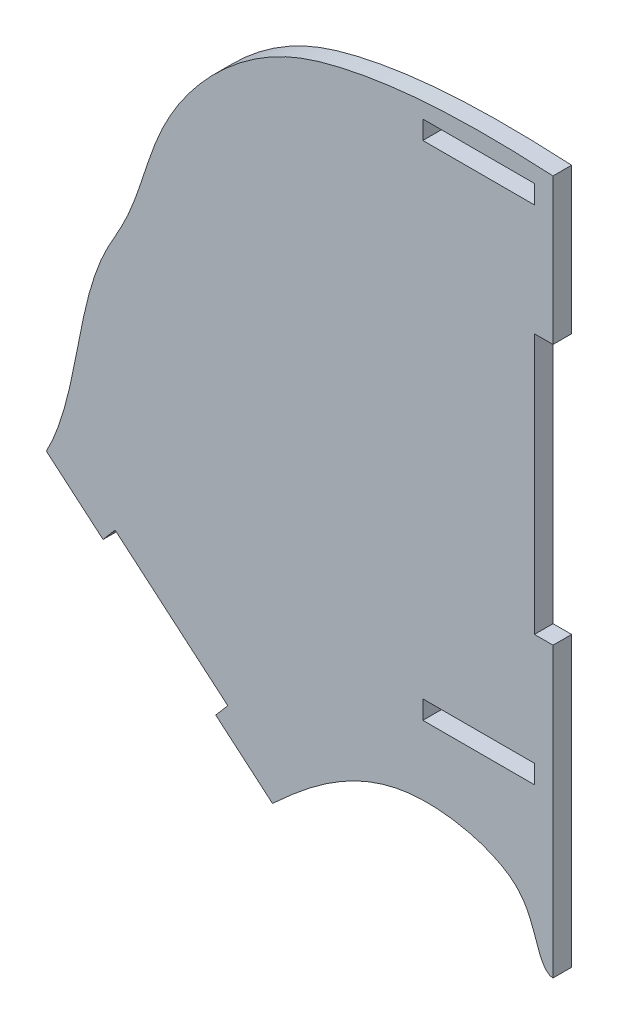
ISO-10303-21;
HEADER;
FILE_DESCRIPTION(('STEP AP214'),'2;1');
FILE_NAME('part.step','',(''),(''),'','','');
FILE_SCHEMA(('AUTOMOTIVE_DESIGN { 1 0 10303 214 1 1 1 1 }'));
ENDSEC;
DATA;
#1=APPLICATION_CONTEXT('core data for automotive mechanical design processes');
#2=APPLICATION_PROTOCOL_DEFINITION('international standard','automotive_design',2000,#1);
#3=PRODUCT_CONTEXT('',#1,'mechanical');
#4=PRODUCT('Part','Part','',(#3));
#5=PRODUCT_RELATED_PRODUCT_CATEGORY('part','',(#4));
#6=PRODUCT_DEFINITION_FORMATION('','',#4);
#7=PRODUCT_DEFINITION_CONTEXT('part definition',#1,'design');
#8=PRODUCT_DEFINITION('design','',#6,#7);
#9=PRODUCT_DEFINITION_SHAPE('','',#8);
#10=(LENGTH_UNIT() NAMED_UNIT(*) SI_UNIT(.MILLI.,.METRE.));
#11=(NAMED_UNIT(*) PLANE_ANGLE_UNIT() SI_UNIT($,.RADIAN.));
#12=(NAMED_UNIT(*) SI_UNIT($,.STERADIAN.) SOLID_ANGLE_UNIT());
#13=UNCERTAINTY_MEASURE_WITH_UNIT(LENGTH_MEASURE(1.E-05),#10,'distance_accuracy_value','');
#14=(GEOMETRIC_REPRESENTATION_CONTEXT(3) GLOBAL_UNCERTAINTY_ASSIGNED_CONTEXT((#13)) GLOBAL_UNIT_ASSIGNED_CONTEXT((#10,
#11,#12)) REPRESENTATION_CONTEXT('',''));
#15=CARTESIAN_POINT('',(0.,0.,0.));
#16=DIRECTION('',(0.,0.,1.));
#17=DIRECTION('',(1.,0.,0.));
#18=AXIS2_PLACEMENT_3D('',#15,#16,#17);
#19=CARTESIAN_POINT('',(128.16831907634,357.821631056354,0.558515458938516));
#20=DIRECTION('',(0.,0.,-1.));
#21=DIRECTION('',(-1.,0.,0.));
#22=AXIS2_PLACEMENT_3D('',#19,#20,#21);
#23=PLANE('',#22);
#24=CARTESIAN_POINT('',(190.920224240419,377.495203298685,0.558515458938516));
#25=CARTESIAN_POINT('',(179.228577403841,378.123882118353,0.558515458938516));
#26=CARTESIAN_POINT('',(164.047723098161,378.073363727816,0.558515458938516));
#27=CARTESIAN_POINT('',(143.978890164457,372.597839563043,0.558515458938516));
#28=CARTESIAN_POINT('',(132.17034424929,364.03285747436,0.558515458938516));
#29=CARTESIAN_POINT('',(122.518397053617,350.063428059534,0.558515458938516));
#30=CARTESIAN_POINT('',(119.794011723898,337.005382787157,0.558515458938516));
#31=CARTESIAN_POINT('',(109.10983386091,319.977623746502,0.558515458938516));
#32=CARTESIAN_POINT('',(110.074675896079,304.22790963995,0.558515458938516));
#33=CARTESIAN_POINT('',(104.425717212394,293.558329542994,0.558515458938516));
#34=B_SPLINE_CURVE_WITH_KNOTS('',3,(#24,#25,#26,#27,#28,#29,#30,#31,#32,#33),.UNSPECIFIED.,.F.,
.F.,(4,1,1,1,1,1,1,4),(0.,0.256177885566044,0.326770854067347,0.450574258980141,
0.564972920578244,0.689615914149957,0.73575471902178,1.),.UNSPECIFIED.);
#35=CARTESIAN_POINT('',(190.920224240419,377.495203298685,0.558515458938516));
#36=VERTEX_POINT('',#35);
#37=CARTESIAN_POINT('',(104.425717212394,293.558329542994,0.558515458938516));
#38=VERTEX_POINT('',#37);
#39=EDGE_CURVE('E290',#36,#38,#34,.T.);
#40=ORIENTED_EDGE('',*,*,#39,.F.);
#41=DIRECTION('',(0.,1.,0.));
#42=VECTOR('',#41,1.);
#43=CARTESIAN_POINT('',(190.920224240419,258.914024308651,0.558515458938516));
#44=LINE('',#43,#42);
#45=CARTESIAN_POINT('',(190.920224240419,352.57227708954,0.558515457864788));
#46=VERTEX_POINT('',#45);
#47=EDGE_CURVE('E551',#46,#36,#44,.T.);
#48=ORIENTED_EDGE('',*,*,#47,.F.);
#49=DIRECTION('',(1.,0.,0.));
#50=VECTOR('',#49,1.);
#51=CARTESIAN_POINT('',(187.745224240419,352.57227708954,0.558515457864788));
#52=LINE('',#51,#50);
#53=CARTESIAN_POINT('',(187.745224240419,352.57227708954,0.558515457864788));
#54=VERTEX_POINT('',#53);
#55=EDGE_CURVE('E226',#54,#46,#52,.T.);
#56=ORIENTED_EDGE('',*,*,#55,.F.);
#57=DIRECTION('',(0.,-1.,0.));
#58=VECTOR('',#57,1.);
#59=CARTESIAN_POINT('',(187.745224240419,357.821631056354,0.558515458938516));
#60=LINE('',#59,#58);
#61=CARTESIAN_POINT('',(187.745224240419,308.12227708954,0.55851545786478));
#62=VERTEX_POINT('',#61);
#63=EDGE_CURVE('E225',#54,#62,#60,.T.);
#64=ORIENTED_EDGE('',*,*,#63,.T.);
#65=DIRECTION('',(1.,0.,0.));
#66=VECTOR('',#65,1.);
#67=CARTESIAN_POINT('',(187.745224240419,308.12227708954,0.55851545786478));
#68=LINE('',#67,#66);
#69=CARTESIAN_POINT('',(190.920224240419,308.12227708954,0.55851545786478));
#70=VERTEX_POINT('',#69);
#71=EDGE_CURVE('E228',#62,#70,#68,.T.);
#72=ORIENTED_EDGE('',*,*,#71,.T.);
#73=CARTESIAN_POINT('',(190.920224240419,258.914024308651,0.558515458938516));
#74=VERTEX_POINT('',#73);
#75=EDGE_CURVE('E298',#74,#70,#44,.T.);
#76=ORIENTED_EDGE('',*,*,#75,.F.);
#77=CARTESIAN_POINT('',(143.022728413072,260.774121233985,0.558515458938516));
#78=CARTESIAN_POINT('',(149.722749072518,266.960677117123,0.558515458938516));
#79=CARTESIAN_POINT('',(161.869600978462,276.820189664583,0.558515458938516));
#80=CARTESIAN_POINT('',(182.454516969944,272.399090910471,0.558515458938516));
#81=CARTESIAN_POINT('',(187.43016425015,266.375487534413,0.558515458938516));
#82=CARTESIAN_POINT('',(189.097390558734,258.932616631534,0.558515458938516));
#83=CARTESIAN_POINT('',(190.920224240419,258.914024308651,0.558515458938516));
#84=B_SPLINE_CURVE_WITH_KNOTS('',3,(#77,#78,#79,#80,#81,#82,#83),.UNSPECIFIED.,.F.,.F.,(4,1,1,1,
4),(0.,0.461148567866959,0.724471904206736,0.870774393200556,1.),.UNSPECIFIED.);
#85=CARTESIAN_POINT('',(143.022728413072,260.774121233985,0.558515458938516));
#86=VERTEX_POINT('',#85);
#87=EDGE_CURVE('E547',#86,#74,#84,.T.);
#88=ORIENTED_EDGE('',*,*,#87,.F.);
#89=DIRECTION('',(0.762165840447723,-0.647381828332102,0.));
#90=VECTOR('',#89,1.);
#91=CARTESIAN_POINT('',(104.425717212394,293.558329542994,0.558515458938516));
#92=LINE('',#91,#90);
#93=CARTESIAN_POINT('',(133.343222239386,268.995870453803,0.558515458938516));
#94=VERTEX_POINT('',#93);
#95=EDGE_CURVE('E537',#94,#86,#92,.T.);
#96=ORIENTED_EDGE('',*,*,#95,.F.);
#97=DIRECTION('',(-0.647381828332102,-0.762165840447724,0.));
#98=VECTOR('',#97,1.);
#99=CARTESIAN_POINT('',(151.708827152805,290.617788295133,0.558515458938516));
#100=LINE('',#99,#98);
#101=CARTESIAN_POINT('',(135.39865954434,271.415746997224,0.558515458938516));
#102=VERTEX_POINT('',#101);
#103=EDGE_CURVE('E271',#102,#94,#100,.T.);
#104=ORIENTED_EDGE('',*,*,#103,.F.);
#105=DIRECTION('',(-0.762165840447724,0.647381828332102,0.));
#106=VECTOR('',#105,1.);
#107=CARTESIAN_POINT('',(88.5648508248975,311.196271270968,0.558515458938516));
#108=LINE('',#107,#106);
#109=CARTESIAN_POINT('',(116.160660691035,287.756456866598,0.558515458938516));
#110=VERTEX_POINT('',#109);
#111=EDGE_CURVE('E11',#102,#110,#108,.T.);
#112=ORIENTED_EDGE('',*,*,#111,.T.);
#113=DIRECTION('',(-0.647381828332102,-0.762165840447724,0.));
#114=VECTOR('',#113,1.);
#115=CARTESIAN_POINT('',(132.4708282995,306.958498164507,0.558515458938516));
#116=LINE('',#115,#114);
#117=CARTESIAN_POINT('',(114.10522338608,285.336580323177,0.558515458938516));
#118=VERTEX_POINT('',#117);
#119=EDGE_CURVE('E278',#110,#118,#116,.T.);
#120=ORIENTED_EDGE('',*,*,#119,.T.);
#121=EDGE_CURVE('E538',#38,#118,#92,.T.);
#122=ORIENTED_EDGE('',*,*,#121,.F.);
#123=EDGE_LOOP('',(#40,#48,#56,#64,#72,#76,#88,#96,#104,#112,#120,#122));
#124=FACE_BOUND('',#123,.T.);
#125=DIRECTION('',(-1.,0.,0.));
#126=VECTOR('',#125,1.);
#127=CARTESIAN_POINT('',(128.16831907634,371.62227708954,0.558515458938516));
#128=LINE('',#127,#126);
#129=CARTESIAN_POINT('',(187.745224240419,371.62227708954,0.55851545786479));
#130=VERTEX_POINT('',#129);
#131=CARTESIAN_POINT('',(168.695224240419,371.62227708954,0.558515458938516));
#132=VERTEX_POINT('',#131);
#133=EDGE_CURVE('E248',#130,#132,#128,.T.);
#134=ORIENTED_EDGE('',*,*,#133,.F.);
#135=DIRECTION('',(0.,1.,0.));
#136=VECTOR('',#135,1.);
#137=CARTESIAN_POINT('',(187.745224240419,371.62227708954,0.55851545786479));
#138=LINE('',#137,#136);
#139=CARTESIAN_POINT('',(187.745224240419,374.79727708954,0.55851545786479));
#140=VERTEX_POINT('',#139);
#141=EDGE_CURVE('E236',#130,#140,#138,.T.);
#142=ORIENTED_EDGE('',*,*,#141,.T.);
#143=DIRECTION('',(-1.,0.,0.));
#144=VECTOR('',#143,1.);
#145=CARTESIAN_POINT('',(128.16831907634,374.79727708954,0.558515458938516));
#146=LINE('',#145,#144);
#147=CARTESIAN_POINT('',(168.695224240419,374.79727708954,0.55851545786479));
#148=VERTEX_POINT('',#147);
#149=EDGE_CURVE('E256',#140,#148,#146,.T.);
#150=ORIENTED_EDGE('',*,*,#149,.T.);
#151=DIRECTION('',(0.,1.,0.));
#152=VECTOR('',#151,1.);
#153=CARTESIAN_POINT('',(168.695224240419,371.62227708954,0.55851545786479));
#154=LINE('',#153,#152);
#155=EDGE_CURVE('E235',#132,#148,#154,.T.);
#156=ORIENTED_EDGE('',*,*,#155,.F.);
#157=EDGE_LOOP('',(#134,#142,#150,#156));
#158=FACE_BOUND('',#157,.T.);
#159=DIRECTION('',(-1.,0.,0.));
#160=VECTOR('',#159,1.);
#161=CARTESIAN_POINT('',(128.16831907634,285.89727708954,0.558515458938516));
#162=LINE('',#161,#160);
#163=CARTESIAN_POINT('',(187.745224240419,285.89727708954,0.558515458938515));
#164=VERTEX_POINT('',#163);
#165=CARTESIAN_POINT('',(168.695224240419,285.89727708954,0.558515458938516));
#166=VERTEX_POINT('',#165);
#167=EDGE_CURVE('E180',#164,#166,#162,.T.);
#168=ORIENTED_EDGE('',*,*,#167,.F.);
#169=DIRECTION('',(0.,1.,0.));
#170=VECTOR('',#169,1.);
#171=CARTESIAN_POINT('',(187.745224240419,357.821631056354,0.558515458938516));
#172=LINE('',#171,#170);
#173=CARTESIAN_POINT('',(187.745224240419,289.07227708954,0.558515458938515));
#174=VERTEX_POINT('',#173);
#175=EDGE_CURVE('E190',#164,#174,#172,.T.);
#176=ORIENTED_EDGE('',*,*,#175,.T.);
#177=DIRECTION('',(-1.,0.,0.));
#178=VECTOR('',#177,1.);
#179=CARTESIAN_POINT('',(128.16831907634,289.07227708954,0.558515458938516));
#180=LINE('',#179,#178);
#181=CARTESIAN_POINT('',(168.695224240419,289.07227708954,0.558515458938515));
#182=VERTEX_POINT('',#181);
#183=EDGE_CURVE('E202',#174,#182,#180,.T.);
#184=ORIENTED_EDGE('',*,*,#183,.T.);
#185=DIRECTION('',(0.,1.,0.));
#186=VECTOR('',#185,1.);
#187=CARTESIAN_POINT('',(168.695224240419,357.821631056354,0.558515458938516));
#188=LINE('',#187,#186);
#189=EDGE_CURVE('E205',#166,#182,#188,.T.);
#190=ORIENTED_EDGE('',*,*,#189,.F.);
#191=EDGE_LOOP('',(#168,#176,#184,#190));
#192=FACE_BOUND('',#191,.T.);
#193=ADVANCED_FACE('F35',(#124,#158,#192),#23,.T.);
#194=CARTESIAN_POINT('',(128.16831907634,357.821631056354,3.73351545858061));
#195=DIRECTION('',(0.,0.,-1.));
#196=DIRECTION('',(-1.,0.,0.));
#197=AXIS2_PLACEMENT_3D('',#194,#195,#196);
#198=PLANE('',#197);
#199=DIRECTION('',(-1.,0.,0.));
#200=VECTOR('',#199,1.);
#201=CARTESIAN_POINT('',(128.16831907634,289.07227708954,3.73351545858061));
#202=LINE('',#201,#200);
#203=CARTESIAN_POINT('',(187.745224240419,289.07227708954,3.73351545750387));
#204=VERTEX_POINT('',#203);
#205=CARTESIAN_POINT('',(168.695224240419,289.07227708954,3.73351545858061));
#206=VERTEX_POINT('',#205);
#207=EDGE_CURVE('E194',#204,#206,#202,.T.);
#208=ORIENTED_EDGE('',*,*,#207,.F.);
#209=DIRECTION('',(0.,1.,0.));
#210=VECTOR('',#209,1.);
#211=CARTESIAN_POINT('',(187.745224240419,285.89727708954,3.73351545750387));
#212=LINE('',#211,#210);
#213=CARTESIAN_POINT('',(187.745224240419,285.89727708954,3.73351545750387));
#214=VERTEX_POINT('',#213);
#215=EDGE_CURVE('E187',#214,#204,#212,.T.);
#216=ORIENTED_EDGE('',*,*,#215,.F.);
#217=DIRECTION('',(-1.,0.,0.));
#218=VECTOR('',#217,1.);
#219=CARTESIAN_POINT('',(128.16831907634,285.89727708954,3.73351545858061));
#220=LINE('',#219,#218);
#221=CARTESIAN_POINT('',(168.695224240419,285.89727708954,3.73351545750387));
#222=VERTEX_POINT('',#221);
#223=EDGE_CURVE('E172',#214,#222,#220,.T.);
#224=ORIENTED_EDGE('',*,*,#223,.T.);
#225=DIRECTION('',(0.,1.,0.));
#226=VECTOR('',#225,1.);
#227=CARTESIAN_POINT('',(168.695224240419,285.89727708954,3.73351545750387));
#228=LINE('',#227,#226);
#229=EDGE_CURVE('E181',#222,#206,#228,.T.);
#230=ORIENTED_EDGE('',*,*,#229,.T.);
#231=EDGE_LOOP('',(#208,#216,#224,#230));
#232=FACE_BOUND('',#231,.T.);
#233=DIRECTION('',(0.,1.,0.));
#234=VECTOR('',#233,1.);
#235=CARTESIAN_POINT('',(190.920224240419,258.914024308651,3.73351545858061));
#236=LINE('',#235,#234);
#237=CARTESIAN_POINT('',(190.920224240419,258.914024308651,3.73351545858061));
#238=VERTEX_POINT('',#237);
#239=CARTESIAN_POINT('',(190.920224240419,308.12227708954,3.73351545858061));
#240=VERTEX_POINT('',#239);
#241=EDGE_CURVE('E311',#238,#240,#236,.T.);
#242=ORIENTED_EDGE('',*,*,#241,.T.);
#243=DIRECTION('',(1.,0.,0.));
#244=VECTOR('',#243,1.);
#245=CARTESIAN_POINT('',(187.745224240419,308.12227708954,3.73351545858061));
#246=LINE('',#245,#244);
#247=CARTESIAN_POINT('',(187.745224240419,308.12227708954,3.73351545858061));
#248=VERTEX_POINT('',#247);
#249=EDGE_CURVE('E218',#248,#240,#246,.T.);
#250=ORIENTED_EDGE('',*,*,#249,.F.);
#251=DIRECTION('',(0.,-1.,0.));
#252=VECTOR('',#251,1.);
#253=CARTESIAN_POINT('',(187.745224240419,352.57227708954,3.73351545858061));
#254=LINE('',#253,#252);
#255=CARTESIAN_POINT('',(187.745224240419,352.57227708954,3.73351545858061));
#256=VERTEX_POINT('',#255);
#257=EDGE_CURVE('E209',#256,#248,#254,.T.);
#258=ORIENTED_EDGE('',*,*,#257,.F.);
#259=DIRECTION('',(1.,0.,0.));
#260=VECTOR('',#259,1.);
#261=CARTESIAN_POINT('',(187.745224240419,352.57227708954,3.73351545858061));
#262=LINE('',#261,#260);
#263=CARTESIAN_POINT('',(190.920224240419,352.57227708954,3.73351545858061));
#264=VERTEX_POINT('',#263);
#265=EDGE_CURVE('E222',#256,#264,#262,.T.);
#266=ORIENTED_EDGE('',*,*,#265,.T.);
#267=CARTESIAN_POINT('',(190.920224240419,377.495203298685,3.73351545858061));
#268=VERTEX_POINT('',#267);
#269=EDGE_CURVE('E310',#264,#268,#236,.T.);
#270=ORIENTED_EDGE('',*,*,#269,.T.);
#271=CARTESIAN_POINT('',(190.920224240419,377.495203298685,3.73351545858061));
#272=CARTESIAN_POINT('',(179.228577403841,378.123882118353,3.73351545858061));
#273=CARTESIAN_POINT('',(164.047723098161,378.073363727816,3.73351545858061));
#274=CARTESIAN_POINT('',(143.978890164457,372.597839563043,3.73351545858061));
#275=CARTESIAN_POINT('',(132.17034424929,364.03285747436,3.73351545858061));
#276=CARTESIAN_POINT('',(122.518397053617,350.063428059534,3.73351545858061));
#277=CARTESIAN_POINT('',(119.794011723898,337.005382787157,3.73351545858061));
#278=CARTESIAN_POINT('',(109.10983386091,319.977623746502,3.73351545858061));
#279=CARTESIAN_POINT('',(110.074675896079,304.22790963995,3.73351545858061));
#280=CARTESIAN_POINT('',(104.425717212394,293.558329542994,3.73351545858061));
#281=B_SPLINE_CURVE_WITH_KNOTS('',3,(#271,#272,#273,#274,#275,#276,#277,#278,#279,#280),
.UNSPECIFIED.,.F.,.F.,(4,1,1,1,1,1,1,4),(0.,0.256177885566044,0.326770854067347,
0.450574258980141,0.564972920578244,0.689615914149957,0.73575471902178,1.),.UNSPECIFIED.);
#282=CARTESIAN_POINT('',(104.425717212394,293.558329542994,3.73351545858061));
#283=VERTEX_POINT('',#282);
#284=EDGE_CURVE('E291',#268,#283,#281,.T.);
#285=ORIENTED_EDGE('',*,*,#284,.T.);
#286=DIRECTION('',(0.762165840447723,-0.647381828332102,0.));
#287=VECTOR('',#286,1.);
#288=CARTESIAN_POINT('',(104.425717212394,293.558329542994,3.73351545858061));
#289=LINE('',#288,#287);
#290=CARTESIAN_POINT('',(114.10522338608,285.336580323177,3.73351545858061));
#291=VERTEX_POINT('',#290);
#292=EDGE_CURVE('E299',#283,#291,#289,.T.);
#293=ORIENTED_EDGE('',*,*,#292,.T.);
#294=DIRECTION('',(-0.647381828332102,-0.762165840447724,0.));
#295=VECTOR('',#294,1.);
#296=CARTESIAN_POINT('',(132.4708282995,306.958498164507,3.73351545858061));
#297=LINE('',#296,#295);
#298=CARTESIAN_POINT('',(116.160660691035,287.756456866598,3.73351545858061));
#299=VERTEX_POINT('',#298);
#300=EDGE_CURVE('E279',#299,#291,#297,.T.);
#301=ORIENTED_EDGE('',*,*,#300,.F.);
#302=DIRECTION('',(0.762165840447724,-0.647381828332102,0.));
#303=VECTOR('',#302,1.);
#304=CARTESIAN_POINT('',(145.397980675125,262.922347723486,3.73351545858061));
#305=LINE('',#304,#303);
#306=CARTESIAN_POINT('',(135.39865954434,271.415746997224,3.73351545858061));
#307=VERTEX_POINT('',#306);
#308=EDGE_CURVE('E286',#299,#307,#305,.T.);
#309=ORIENTED_EDGE('',*,*,#308,.T.);
#310=DIRECTION('',(-0.647381828332102,-0.762165840447724,0.));
#311=VECTOR('',#310,1.);
#312=CARTESIAN_POINT('',(151.708827152805,290.617788295133,3.73351545858061));
#313=LINE('',#312,#311);
#314=CARTESIAN_POINT('',(133.343222239386,268.995870453803,3.73351545858061));
#315=VERTEX_POINT('',#314);
#316=EDGE_CURVE('E270',#307,#315,#313,.T.);
#317=ORIENTED_EDGE('',*,*,#316,.T.);
#318=CARTESIAN_POINT('',(143.022728413072,260.774121233985,3.73351545858061));
#319=VERTEX_POINT('',#318);
#320=EDGE_CURVE('E297',#315,#319,#289,.T.);
#321=ORIENTED_EDGE('',*,*,#320,.T.);
#322=CARTESIAN_POINT('',(143.022728413072,260.774121233985,3.73351545858061));
#323=CARTESIAN_POINT('',(149.722749072518,266.960677117123,3.73351545858061));
#324=CARTESIAN_POINT('',(161.869600978462,276.820189664583,3.73351545858061));
#325=CARTESIAN_POINT('',(182.454516969944,272.399090910471,3.73351545858061));
#326=CARTESIAN_POINT('',(187.43016425015,266.375487534413,3.73351545858061));
#327=CARTESIAN_POINT('',(189.097390558734,258.932616631534,3.73351545858061));
#328=CARTESIAN_POINT('',(190.920224240419,258.914024308651,3.73351545858061));
#329=B_SPLINE_CURVE_WITH_KNOTS('',3,(#322,#323,#324,#325,#326,#327,#328),.UNSPECIFIED.,.F.,.F.,
(4,1,1,1,4),(0.,0.461148567866959,0.724471904206736,0.870774393200556,1.),.UNSPECIFIED.);
#330=EDGE_CURVE('E305',#319,#238,#329,.T.);
#331=ORIENTED_EDGE('',*,*,#330,.T.);
#332=EDGE_LOOP('',(#242,#250,#258,#266,#270,#285,#293,#301,#309,#317,#321,#331));
#333=FACE_BOUND('',#332,.T.);
#334=DIRECTION('',(-1.,0.,0.));
#335=VECTOR('',#334,1.);
#336=CARTESIAN_POINT('',(128.16831907634,374.79727708954,3.73351545858061));
#337=LINE('',#336,#335);
#338=CARTESIAN_POINT('',(187.745224240419,374.79727708954,3.73351545858061));
#339=VERTEX_POINT('',#338);
#340=CARTESIAN_POINT('',(168.695224240419,374.79727708954,3.73351545858061));
#341=VERTEX_POINT('',#340);
#342=EDGE_CURVE('E259',#339,#341,#337,.T.);
#343=ORIENTED_EDGE('',*,*,#342,.F.);
#344=DIRECTION('',(0.,-1.,0.));
#345=VECTOR('',#344,1.);
#346=CARTESIAN_POINT('',(187.745224240419,357.821631056354,3.73351545858061));
#347=LINE('',#346,#345);
#348=CARTESIAN_POINT('',(187.745224240419,371.62227708954,3.73351545858061));
#349=VERTEX_POINT('',#348);
#350=EDGE_CURVE('E264',#339,#349,#347,.T.);
#351=ORIENTED_EDGE('',*,*,#350,.T.);
#352=DIRECTION('',(-1.,0.,0.));
#353=VECTOR('',#352,1.);
#354=CARTESIAN_POINT('',(128.16831907634,371.62227708954,3.73351545858061));
#355=LINE('',#354,#353);
#356=CARTESIAN_POINT('',(168.695224240419,371.62227708954,3.73351545858061));
#357=VERTEX_POINT('',#356);
#358=EDGE_CURVE('E253',#349,#357,#355,.T.);
#359=ORIENTED_EDGE('',*,*,#358,.T.);
#360=DIRECTION('',(0.,-1.,0.));
#361=VECTOR('',#360,1.);
#362=CARTESIAN_POINT('',(168.695224240419,357.821631056354,3.73351545858061));
#363=LINE('',#362,#361);
#364=EDGE_CURVE('E262',#341,#357,#363,.T.);
#365=ORIENTED_EDGE('',*,*,#364,.F.);
#366=EDGE_LOOP('',(#343,#351,#359,#365));
#367=FACE_BOUND('',#366,.T.);
#368=ADVANCED_FACE('F192',(#232,#333,#367),#198,.F.);
#369=CARTESIAN_POINT('',(190.920224240419,258.914024308651,3.73351545858061));
#370=DIRECTION('',(-1.,0.,0.));
#371=DIRECTION('',(0.,0.,1.));
#372=AXIS2_PLACEMENT_3D('',#369,#370,#371);
#373=PLANE('',#372);
#374=ORIENTED_EDGE('',*,*,#269,.F.);
#375=DIRECTION('',(0.,0.,1.));
#376=VECTOR('',#375,1.);
#377=CARTESIAN_POINT('',(190.920224240419,352.57227708954,0.558515457864788));
#378=LINE('',#377,#376);
#379=EDGE_CURVE('E212',#46,#264,#378,.T.);
#380=ORIENTED_EDGE('',*,*,#379,.F.);
#381=ORIENTED_EDGE('',*,*,#47,.T.);
#382=DIRECTION('',(0.,0.,-1.));
#383=VECTOR('',#382,1.);
#384=CARTESIAN_POINT('',(190.920224240419,377.495203298685,3.73351545858061));
#385=LINE('',#384,#383);
#386=EDGE_CURVE('E535',#268,#36,#385,.T.);
#387=ORIENTED_EDGE('',*,*,#386,.F.);
#388=EDGE_LOOP('',(#374,#380,#381,#387));
#389=FACE_BOUND('',#388,.T.);
#390=ADVANCED_FACE('F326',(#389),#373,.F.);
#391=CARTESIAN_POINT('',(104.425717212394,293.558329542994,3.73351545858061));
#392=DIRECTION('',(0.647381828332102,0.762165840447723,0.));
#393=DIRECTION('',(-0.762165840447724,0.647381828332102,0.));
#394=AXIS2_PLACEMENT_3D('',#391,#392,#393);
#395=PLANE('',#394);
#396=DIRECTION('',(0.,0.,1.));
#397=VECTOR('',#396,1.);
#398=CARTESIAN_POINT('',(114.10522338608,285.336580323177,3.73351545858061));
#399=LINE('',#398,#397);
#400=EDGE_CURVE('E273',#118,#291,#399,.T.);
#401=ORIENTED_EDGE('',*,*,#400,.T.);
#402=ORIENTED_EDGE('',*,*,#292,.F.);
#403=DIRECTION('',(0.,0.,-1.));
#404=VECTOR('',#403,1.);
#405=CARTESIAN_POINT('',(104.425717212394,293.558329542994,3.73351545858061));
#406=LINE('',#405,#404);
#407=EDGE_CURVE('E44',#283,#38,#406,.T.);
#408=ORIENTED_EDGE('',*,*,#407,.T.);
#409=ORIENTED_EDGE('',*,*,#121,.T.);
#410=EDGE_LOOP('',(#401,#402,#408,#409));
#411=FACE_BOUND('',#410,.T.);
#412=ADVANCED_FACE('F323',(#411),#395,.F.);
#413=DIRECTION('',(0.,0.,-1.));
#414=VECTOR('',#413,1.);
#415=CARTESIAN_POINT('',(133.343222239386,268.995870453803,3.73351545858061));
#416=LINE('',#415,#414);
#417=EDGE_CURVE('E267',#315,#94,#416,.T.);
#418=ORIENTED_EDGE('',*,*,#417,.T.);
#419=ORIENTED_EDGE('',*,*,#95,.T.);
#420=DIRECTION('',(0.,0.,-1.));
#421=VECTOR('',#420,1.);
#422=CARTESIAN_POINT('',(143.022728413072,260.774121233985,3.73351545858061));
#423=LINE('',#422,#421);
#424=EDGE_CURVE('E560',#319,#86,#423,.T.);
#425=ORIENTED_EDGE('',*,*,#424,.F.);
#426=ORIENTED_EDGE('',*,*,#320,.F.);
#427=EDGE_LOOP('',(#418,#419,#425,#426));
#428=FACE_BOUND('',#427,.T.);
#429=ADVANCED_FACE('F325',(#428),#395,.F.);
#430=DIRECTION('',(0.,0.,-1.));
#431=VECTOR('',#430,1.);
#432=SURFACE_OF_LINEAR_EXTRUSION('',#281,#431);
#433=ORIENTED_EDGE('',*,*,#39,.T.);
#434=ORIENTED_EDGE('',*,*,#407,.F.);
#435=ORIENTED_EDGE('',*,*,#284,.F.);
#436=ORIENTED_EDGE('',*,*,#386,.T.);
#437=EDGE_LOOP('',(#433,#434,#435,#436));
#438=FACE_BOUND('',#437,.T.);
#439=ADVANCED_FACE('F37',(#438),#432,.F.);
#440=DIRECTION('',(0.,0.,-1.));
#441=VECTOR('',#440,1.);
#442=SURFACE_OF_LINEAR_EXTRUSION('',#329,#441);
#443=ORIENTED_EDGE('',*,*,#87,.T.);
#444=DIRECTION('',(0.,0.,-1.));
#445=VECTOR('',#444,1.);
#446=CARTESIAN_POINT('',(190.920224240419,258.914024308651,3.73351545858061));
#447=LINE('',#446,#445);
#448=EDGE_CURVE('E557',#238,#74,#447,.T.);
#449=ORIENTED_EDGE('',*,*,#448,.F.);
#450=ORIENTED_EDGE('',*,*,#330,.F.);
#451=ORIENTED_EDGE('',*,*,#424,.T.);
#452=EDGE_LOOP('',(#443,#449,#450,#451));
#453=FACE_BOUND('',#452,.T.);
#454=ADVANCED_FACE('F317',(#453),#442,.F.);
#455=ORIENTED_EDGE('',*,*,#75,.T.);
#456=DIRECTION('',(0.,0.,-1.));
#457=VECTOR('',#456,1.);
#458=CARTESIAN_POINT('',(190.920224240419,308.12227708954,0.55851545786478));
#459=LINE('',#458,#457);
#460=EDGE_CURVE('E208',#240,#70,#459,.T.);
#461=ORIENTED_EDGE('',*,*,#460,.F.);
#462=ORIENTED_EDGE('',*,*,#241,.F.);
#463=ORIENTED_EDGE('',*,*,#448,.T.);
#464=EDGE_LOOP('',(#455,#461,#462,#463));
#465=FACE_BOUND('',#464,.T.);
#466=ADVANCED_FACE('F320',(#465),#373,.F.);
#467=CARTESIAN_POINT('',(145.397980675125,262.922347723486,10.0835154589385));
#468=DIRECTION('',(-0.647381828332102,-0.762165840447724,0.));
#469=DIRECTION('',(-0.762165840447724,0.647381828332102,0.));
#470=AXIS2_PLACEMENT_3D('',#467,#468,#469);
#471=PLANE('',#470);
#472=ORIENTED_EDGE('',*,*,#308,.F.);
#473=DIRECTION('',(0.,0.,1.));
#474=VECTOR('',#473,1.);
#475=CARTESIAN_POINT('',(116.160660691035,287.756456866598,10.0835154589385));
#476=LINE('',#475,#474);
#477=EDGE_CURVE('E281',#110,#299,#476,.T.);
#478=ORIENTED_EDGE('',*,*,#477,.F.);
#479=ORIENTED_EDGE('',*,*,#111,.F.);
#480=DIRECTION('',(0.,0.,-1.));
#481=VECTOR('',#480,1.);
#482=CARTESIAN_POINT('',(135.39865954434,271.415746997224,10.0835154589385));
#483=LINE('',#482,#481);
#484=EDGE_CURVE('E289',#307,#102,#483,.T.);
#485=ORIENTED_EDGE('',*,*,#484,.F.);
#486=EDGE_LOOP('',(#472,#478,#479,#485));
#487=FACE_BOUND('',#486,.T.);
#488=ADVANCED_FACE('F343',(#487),#471,.T.);
#489=CARTESIAN_POINT('',(132.4708282995,306.958498164507,3.73351545858061));
#490=DIRECTION('',(0.762165840447724,-0.647381828332102,0.));
#491=DIRECTION('',(-0.647381828332102,-0.762165840447724,0.));
#492=AXIS2_PLACEMENT_3D('',#489,#490,#491);
#493=PLANE('',#492);
#494=ORIENTED_EDGE('',*,*,#119,.F.);
#495=ORIENTED_EDGE('',*,*,#477,.T.);
#496=ORIENTED_EDGE('',*,*,#300,.T.);
#497=ORIENTED_EDGE('',*,*,#400,.F.);
#498=EDGE_LOOP('',(#494,#495,#496,#497));
#499=FACE_BOUND('',#498,.T.);
#500=ADVANCED_FACE('F346',(#499),#493,.T.);
#501=CARTESIAN_POINT('',(151.708827152805,290.617788295133,3.73351545858061));
#502=DIRECTION('',(-0.762165840447724,0.647381828332102,0.));
#503=DIRECTION('',(0.647381828332102,0.762165840447724,0.));
#504=AXIS2_PLACEMENT_3D('',#501,#502,#503);
#505=PLANE('',#504);
#506=ORIENTED_EDGE('',*,*,#316,.F.);
#507=ORIENTED_EDGE('',*,*,#484,.T.);
#508=ORIENTED_EDGE('',*,*,#103,.T.);
#509=ORIENTED_EDGE('',*,*,#417,.F.);
#510=EDGE_LOOP('',(#506,#507,#508,#509));
#511=FACE_BOUND('',#510,.T.);
#512=ADVANCED_FACE('F350',(#511),#505,.T.);
#513=CARTESIAN_POINT('',(187.745224240419,371.62227708954,10.0835154578648));
#514=DIRECTION('',(1.,0.,0.));
#515=DIRECTION('',(0.,0.,-1.));
#516=AXIS2_PLACEMENT_3D('',#513,#514,#515);
#517=PLANE('',#516);
#518=DIRECTION('',(0.,0.,-1.));
#519=VECTOR('',#518,1.);
#520=CARTESIAN_POINT('',(187.745224240419,374.79727708954,10.0835154578648));
#521=LINE('',#520,#519);
#522=EDGE_CURVE('E244',#339,#140,#521,.T.);
#523=ORIENTED_EDGE('',*,*,#522,.T.);
#524=ORIENTED_EDGE('',*,*,#141,.F.);
#525=DIRECTION('',(0.,0.,-1.));
#526=VECTOR('',#525,1.);
#527=CARTESIAN_POINT('',(187.745224240419,371.62227708954,10.0835154578648));
#528=LINE('',#527,#526);
#529=EDGE_CURVE('E245',#349,#130,#528,.T.);
#530=ORIENTED_EDGE('',*,*,#529,.F.);
#531=ORIENTED_EDGE('',*,*,#350,.F.);
#532=EDGE_LOOP('',(#523,#524,#530,#531));
#533=FACE_BOUND('',#532,.T.);
#534=ADVANCED_FACE('F354',(#533),#517,.F.);
#535=CARTESIAN_POINT('',(168.695224240419,371.62227708954,10.0835154578648));
#536=DIRECTION('',(1.,0.,0.));
#537=DIRECTION('',(0.,0.,-1.));
#538=AXIS2_PLACEMENT_3D('',#535,#536,#537);
#539=PLANE('',#538);
#540=ORIENTED_EDGE('',*,*,#364,.T.);
#541=DIRECTION('',(0.,0.,-1.));
#542=VECTOR('',#541,1.);
#543=CARTESIAN_POINT('',(168.695224240419,371.62227708954,10.0835154578648));
#544=LINE('',#543,#542);
#545=EDGE_CURVE('E239',#357,#132,#544,.T.);
#546=ORIENTED_EDGE('',*,*,#545,.T.);
#547=ORIENTED_EDGE('',*,*,#155,.T.);
#548=DIRECTION('',(0.,0.,-1.));
#549=VECTOR('',#548,1.);
#550=CARTESIAN_POINT('',(168.695224240419,374.79727708954,10.0835154578648));
#551=LINE('',#550,#549);
#552=EDGE_CURVE('E242',#341,#148,#551,.T.);
#553=ORIENTED_EDGE('',*,*,#552,.F.);
#554=EDGE_LOOP('',(#540,#546,#547,#553));
#555=FACE_BOUND('',#554,.T.);
#556=ADVANCED_FACE('F360',(#555),#539,.T.);
#557=CARTESIAN_POINT('',(190.920224240419,374.79727708954,19.6085154578648));
#558=DIRECTION('',(0.,-1.,0.));
#559=DIRECTION('',(0.,0.,-1.));
#560=AXIS2_PLACEMENT_3D('',#557,#558,#559);
#561=PLANE('',#560);
#562=ORIENTED_EDGE('',*,*,#342,.T.);
#563=ORIENTED_EDGE('',*,*,#552,.T.);
#564=ORIENTED_EDGE('',*,*,#149,.F.);
#565=ORIENTED_EDGE('',*,*,#522,.F.);
#566=EDGE_LOOP('',(#562,#563,#564,#565));
#567=FACE_BOUND('',#566,.T.);
#568=ADVANCED_FACE('F356',(#567),#561,.T.);
#569=CARTESIAN_POINT('',(190.920224240419,371.62227708954,19.6085154578648));
#570=DIRECTION('',(0.,-1.,0.));
#571=DIRECTION('',(0.,0.,-1.));
#572=AXIS2_PLACEMENT_3D('',#569,#570,#571);
#573=PLANE('',#572);
#574=ORIENTED_EDGE('',*,*,#529,.T.);
#575=ORIENTED_EDGE('',*,*,#133,.T.);
#576=ORIENTED_EDGE('',*,*,#545,.F.);
#577=ORIENTED_EDGE('',*,*,#358,.F.);
#578=EDGE_LOOP('',(#574,#575,#576,#577));
#579=FACE_BOUND('',#578,.T.);
#580=ADVANCED_FACE('F359',(#579),#573,.F.);
#581=CARTESIAN_POINT('',(187.745224240419,0.,0.));
#582=DIRECTION('',(1.,0.,0.));
#583=DIRECTION('',(0.,0.,-1.));
#584=AXIS2_PLACEMENT_3D('',#581,#582,#583);
#585=PLANE('',#584);
#586=DIRECTION('',(0.,0.,1.));
#587=VECTOR('',#586,1.);
#588=CARTESIAN_POINT('',(187.745224240419,352.57227708954,0.558515457864788));
#589=LINE('',#588,#587);
#590=EDGE_CURVE('E215',#54,#256,#589,.T.);
#591=ORIENTED_EDGE('',*,*,#590,.T.);
#592=ORIENTED_EDGE('',*,*,#257,.T.);
#593=DIRECTION('',(0.,0.,-1.));
#594=VECTOR('',#593,1.);
#595=CARTESIAN_POINT('',(187.745224240419,308.12227708954,0.55851545786478));
#596=LINE('',#595,#594);
#597=EDGE_CURVE('E211',#248,#62,#596,.T.);
#598=ORIENTED_EDGE('',*,*,#597,.T.);
#599=ORIENTED_EDGE('',*,*,#63,.F.);
#600=EDGE_LOOP('',(#591,#592,#598,#599));
#601=FACE_BOUND('',#600,.T.);
#602=ADVANCED_FACE('F364',(#601),#585,.T.);
#603=CARTESIAN_POINT('',(187.745224240419,352.57227708954,0.558515457864788));
#604=DIRECTION('',(0.,1.,0.));
#605=DIRECTION('',(1.,0.,0.));
#606=AXIS2_PLACEMENT_3D('',#603,#604,#605);
#607=PLANE('',#606);
#608=ORIENTED_EDGE('',*,*,#379,.T.);
#609=ORIENTED_EDGE('',*,*,#265,.F.);
#610=ORIENTED_EDGE('',*,*,#590,.F.);
#611=ORIENTED_EDGE('',*,*,#55,.T.);
#612=EDGE_LOOP('',(#608,#609,#610,#611));
#613=FACE_BOUND('',#612,.T.);
#614=ADVANCED_FACE('F376',(#613),#607,.F.);
#615=CARTESIAN_POINT('',(187.745224240419,308.12227708954,0.55851545786478));
#616=DIRECTION('',(0.,-1.,0.));
#617=DIRECTION('',(-1.,0.,0.));
#618=AXIS2_PLACEMENT_3D('',#615,#616,#617);
#619=PLANE('',#618);
#620=ORIENTED_EDGE('',*,*,#460,.T.);
#621=ORIENTED_EDGE('',*,*,#71,.F.);
#622=ORIENTED_EDGE('',*,*,#597,.F.);
#623=ORIENTED_EDGE('',*,*,#249,.T.);
#624=EDGE_LOOP('',(#620,#621,#622,#623));
#625=FACE_BOUND('',#624,.T.);
#626=ADVANCED_FACE('F372',(#625),#619,.F.);
#627=CARTESIAN_POINT('',(190.920224240419,289.07227708954,60.8835154575039));
#628=DIRECTION('',(0.,-1.,0.));
#629=DIRECTION('',(0.,0.,-1.));
#630=AXIS2_PLACEMENT_3D('',#627,#628,#629);
#631=PLANE('',#630);
#632=DIRECTION('',(0.,0.,1.));
#633=VECTOR('',#632,1.);
#634=CARTESIAN_POINT('',(187.745224240419,289.07227708954,51.3585154575039));
#635=LINE('',#634,#633);
#636=EDGE_CURVE('E397',#174,#204,#635,.T.);
#637=ORIENTED_EDGE('',*,*,#636,.T.);
#638=ORIENTED_EDGE('',*,*,#207,.T.);
#639=DIRECTION('',(0.,0.,1.));
#640=VECTOR('',#639,1.);
#641=CARTESIAN_POINT('',(168.695224240419,289.07227708954,51.3585154575039));
#642=LINE('',#641,#640);
#643=EDGE_CURVE('E56',#182,#206,#642,.T.);
#644=ORIENTED_EDGE('',*,*,#643,.F.);
#645=ORIENTED_EDGE('',*,*,#183,.F.);
#646=EDGE_LOOP('',(#637,#638,#644,#645));
#647=FACE_BOUND('',#646,.T.);
#648=ADVANCED_FACE('F375',(#647),#631,.T.);
#649=CARTESIAN_POINT('',(190.920224240419,285.89727708954,60.8835154575039));
#650=DIRECTION('',(0.,-1.,0.));
#651=DIRECTION('',(0.,0.,-1.));
#652=AXIS2_PLACEMENT_3D('',#649,#650,#651);
#653=PLANE('',#652);
#654=ORIENTED_EDGE('',*,*,#167,.T.);
#655=DIRECTION('',(0.,0.,1.));
#656=VECTOR('',#655,1.);
#657=CARTESIAN_POINT('',(168.695224240419,285.89727708954,51.3585154575039));
#658=LINE('',#657,#656);
#659=EDGE_CURVE('E51',#166,#222,#658,.T.);
#660=ORIENTED_EDGE('',*,*,#659,.T.);
#661=ORIENTED_EDGE('',*,*,#223,.F.);
#662=DIRECTION('',(0.,0.,1.));
#663=VECTOR('',#662,1.);
#664=CARTESIAN_POINT('',(187.745224240419,285.89727708954,51.3585154575039));
#665=LINE('',#664,#663);
#666=EDGE_CURVE('E175',#164,#214,#665,.T.);
#667=ORIENTED_EDGE('',*,*,#666,.F.);
#668=EDGE_LOOP('',(#654,#660,#661,#667));
#669=FACE_BOUND('',#668,.T.);
#670=ADVANCED_FACE('F174',(#669),#653,.F.);
#671=CARTESIAN_POINT('',(187.745224240419,285.89727708954,51.3585154575039));
#672=DIRECTION('',(-1.,0.,0.));
#673=DIRECTION('',(0.,0.,1.));
#674=AXIS2_PLACEMENT_3D('',#671,#672,#673);
#675=PLANE('',#674);
#676=ORIENTED_EDGE('',*,*,#666,.T.);
#677=ORIENTED_EDGE('',*,*,#215,.T.);
#678=ORIENTED_EDGE('',*,*,#636,.F.);
#679=ORIENTED_EDGE('',*,*,#175,.F.);
#680=EDGE_LOOP('',(#676,#677,#678,#679));
#681=FACE_BOUND('',#680,.T.);
#682=ADVANCED_FACE('F185',(#681),#675,.T.);
#683=CARTESIAN_POINT('',(168.695224240419,285.89727708954,51.3585154575039));
#684=DIRECTION('',(-1.,0.,0.));
#685=DIRECTION('',(0.,0.,1.));
#686=AXIS2_PLACEMENT_3D('',#683,#684,#685);
#687=PLANE('',#686);
#688=ORIENTED_EDGE('',*,*,#189,.T.);
#689=ORIENTED_EDGE('',*,*,#643,.T.);
#690=ORIENTED_EDGE('',*,*,#229,.F.);
#691=ORIENTED_EDGE('',*,*,#659,.F.);
#692=EDGE_LOOP('',(#688,#689,#690,#691));
#693=FACE_BOUND('',#692,.T.);
#694=ADVANCED_FACE('F391',(#693),#687,.F.);
#695=CLOSED_SHELL('',(#193,#368,#390,#412,#429,#439,#454,#466,#488,#500,#512,#534,#556,#568,
#580,#602,#614,#626,#648,#670,#682,#694));
#696=MANIFOLD_SOLID_BREP('B2',#695);
#697=ADVANCED_BREP_SHAPE_REPRESENTATION('',(#18,#696),#14);
#698=SHAPE_DEFINITION_REPRESENTATION(#9,#697);
ENDSEC;
END-ISO-10303-21;
